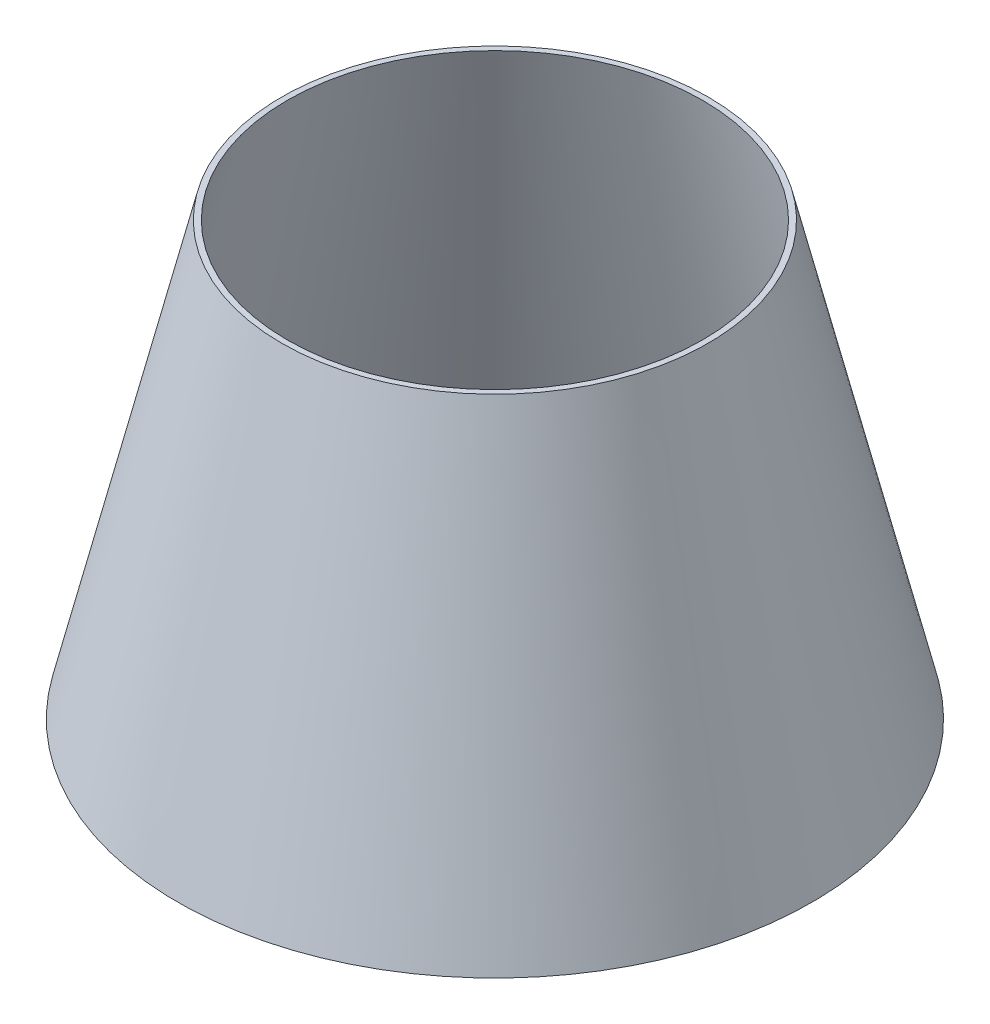
ISO-10303-21;
HEADER;
FILE_DESCRIPTION(('STEP AP214'),'2;1');
FILE_NAME('part.step','',(''),(''),'','','');
FILE_SCHEMA(('AUTOMOTIVE_DESIGN { 1 0 10303 214 1 1 1 1 }'));
ENDSEC;
DATA;
#1=APPLICATION_CONTEXT('core data for automotive mechanical design processes');
#2=APPLICATION_PROTOCOL_DEFINITION('international standard','automotive_design',2000,#1);
#3=PRODUCT_CONTEXT('',#1,'mechanical');
#4=PRODUCT('Part','Part','',(#3));
#5=PRODUCT_RELATED_PRODUCT_CATEGORY('part','',(#4));
#6=PRODUCT_DEFINITION_FORMATION('','',#4);
#7=PRODUCT_DEFINITION_CONTEXT('part definition',#1,'design');
#8=PRODUCT_DEFINITION('design','',#6,#7);
#9=PRODUCT_DEFINITION_SHAPE('','',#8);
#10=(LENGTH_UNIT() NAMED_UNIT(*) SI_UNIT(.MILLI.,.METRE.));
#11=(NAMED_UNIT(*) PLANE_ANGLE_UNIT() SI_UNIT($,.RADIAN.));
#12=(NAMED_UNIT(*) SI_UNIT($,.STERADIAN.) SOLID_ANGLE_UNIT());
#13=UNCERTAINTY_MEASURE_WITH_UNIT(LENGTH_MEASURE(1.E-05),#10,'distance_accuracy_value','');
#14=(GEOMETRIC_REPRESENTATION_CONTEXT(3) GLOBAL_UNCERTAINTY_ASSIGNED_CONTEXT((#13)) GLOBAL_UNIT_ASSIGNED_CONTEXT((#10,
#11,#12)) REPRESENTATION_CONTEXT('',''));
#15=CARTESIAN_POINT('',(0.,0.,0.));
#16=DIRECTION('',(0.,0.,1.));
#17=DIRECTION('',(1.,0.,0.));
#18=AXIS2_PLACEMENT_3D('',#15,#16,#17);
#19=CARTESIAN_POINT('',(349.842227761556,285.066231551552,0.));
#20=DIRECTION('',(0.,-1.,0.));
#21=DIRECTION('',(0.,0.,-1.));
#22=AXIS2_PLACEMENT_3D('',#19,#20,#21);
#23=CONICAL_SURFACE('',#22,55.6599723016679,0.23609350066855);
#24=CARTESIAN_POINT('',(349.842227761556,363.087013323004,0.));
#25=DIRECTION('',(0.,1.,0.));
#26=DIRECTION('',(0.,0.,1.));
#27=AXIS2_PLACEMENT_3D('',#24,#25,#26);
#28=CIRCLE('',#27,36.8897177106679);
#29=CARTESIAN_POINT('',(349.842227761556,363.087013323004,36.8897177106679));
#30=VERTEX_POINT('',#29);
#31=EDGE_CURVE('E10',#30,#30,#28,.T.);
#32=ORIENTED_EDGE('',*,*,#31,.T.);
#33=EDGE_LOOP('',(#32));
#34=FACE_BOUND('',#33,.T.);
#35=CARTESIAN_POINT('',(349.842227761556,286.313893784401,0.));
#36=DIRECTION('',(0.,-1.,0.));
#37=DIRECTION('',(0.,0.,-1.));
#38=AXIS2_PLACEMENT_3D('',#35,#36,#37);
#39=CIRCLE('',#38,55.3598094832185);
#40=CARTESIAN_POINT('',(349.842227761556,286.313893784401,-55.3598094832185));
#41=VERTEX_POINT('',#40);
#42=EDGE_CURVE('E51',#41,#41,#39,.T.);
#43=ORIENTED_EDGE('',*,*,#42,.T.);
#44=EDGE_LOOP('',(#43));
#45=FACE_BOUND('',#44,.T.);
#46=ADVANCED_FACE('F39',(#34,#45),#23,.F.);
#47=CARTESIAN_POINT('',(349.842227761556,363.087013323004,0.));
#48=DIRECTION('',(0.,-1.,0.));
#49=DIRECTION('',(0.,0.,-1.));
#50=AXIS2_PLACEMENT_3D('',#47,#48,#49);
#51=CONICAL_SURFACE('',#50,37.8929343069592,0.23605452851496);
#52=CARTESIAN_POINT('',(349.842227761556,363.087013323004,0.));
#53=DIRECTION('',(0.,1.,0.));
#54=DIRECTION('',(0.,0.,1.));
#55=AXIS2_PLACEMENT_3D('',#52,#53,#54);
#56=CIRCLE('',#55,37.8929343069592);
#57=CARTESIAN_POINT('',(349.842227761556,363.087013323004,37.8929343069592));
#58=VERTEX_POINT('',#57);
#59=EDGE_CURVE('E47',#58,#58,#56,.T.);
#60=ORIENTED_EDGE('',*,*,#59,.F.);
#61=EDGE_LOOP('',(#60));
#62=FACE_BOUND('',#61,.T.);
#63=CARTESIAN_POINT('',(349.842227761556,286.313893784401,0.));
#64=DIRECTION('',(0.,-1.,0.));
#65=DIRECTION('',(0.,0.,-1.));
#66=AXIS2_PLACEMENT_3D('',#63,#64,#65);
#67=CIRCLE('',#66,56.3598609211246);
#68=CARTESIAN_POINT('',(349.842227761556,286.313893784401,-56.3598609211246));
#69=VERTEX_POINT('',#68);
#70=EDGE_CURVE('E43',#69,#69,#67,.F.);
#71=ORIENTED_EDGE('',*,*,#70,.T.);
#72=EDGE_LOOP('',(#71));
#73=FACE_BOUND('',#72,.T.);
#74=ADVANCED_FACE('F60',(#62,#73),#51,.T.);
#75=CARTESIAN_POINT('',(311.949293454596,363.087013323004,0.));
#76=DIRECTION('',(0.,1.,0.));
#77=DIRECTION('',(0.,0.,1.));
#78=AXIS2_PLACEMENT_3D('',#75,#76,#77);
#79=PLANE('',#78);
#80=ORIENTED_EDGE('',*,*,#59,.T.);
#81=EDGE_LOOP('',(#80));
#82=FACE_BOUND('',#81,.T.);
#83=ORIENTED_EDGE('',*,*,#31,.F.);
#84=EDGE_LOOP('',(#83));
#85=FACE_BOUND('',#84,.T.);
#86=ADVANCED_FACE('F41',(#82,#85),#79,.T.);
#87=CARTESIAN_POINT('',(349.842227761556,286.313893784401,0.));
#88=DIRECTION('',(0.,-1.,0.));
#89=DIRECTION('',(0.,0.,-1.));
#90=AXIS2_PLACEMENT_3D('',#87,#88,#89);
#91=PLANE('',#90);
#92=ORIENTED_EDGE('',*,*,#42,.F.);
#93=EDGE_LOOP('',(#92));
#94=FACE_BOUND('',#93,.T.);
#95=ORIENTED_EDGE('',*,*,#70,.F.);
#96=EDGE_LOOP('',(#95));
#97=FACE_BOUND('',#96,.T.);
#98=ADVANCED_FACE('F62',(#94,#97),#91,.T.);
#99=CLOSED_SHELL('',(#46,#74,#86,#98));
#100=MANIFOLD_SOLID_BREP('B2',#99);
#101=ADVANCED_BREP_SHAPE_REPRESENTATION('',(#18,#100),#14);
#102=SHAPE_DEFINITION_REPRESENTATION(#9,#101);
ENDSEC;
END-ISO-10303-21;
